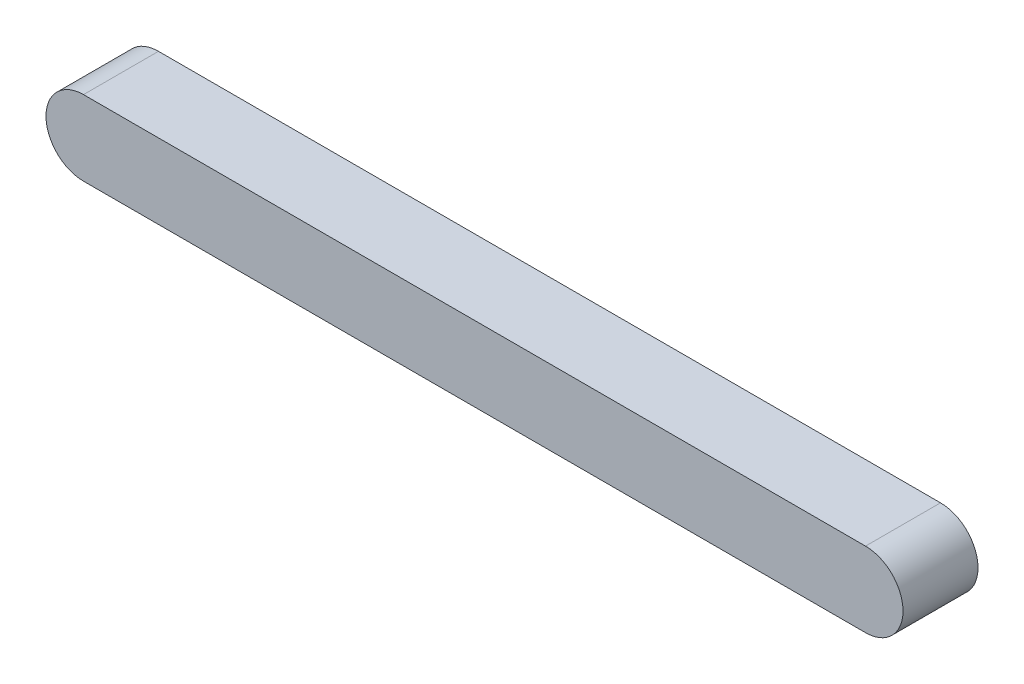
ISO-10303-21;
HEADER;
FILE_DESCRIPTION(('STEP AP214'),'2;1');
FILE_NAME('part.step','',(''),(''),'','','');
FILE_SCHEMA(('AUTOMOTIVE_DESIGN { 1 0 10303 214 1 1 1 1 }'));
ENDSEC;
DATA;
#1=APPLICATION_CONTEXT('core data for automotive mechanical design processes');
#2=APPLICATION_PROTOCOL_DEFINITION('international standard','automotive_design',2000,#1);
#3=PRODUCT_CONTEXT('',#1,'mechanical');
#4=PRODUCT('Part','Part','',(#3));
#5=PRODUCT_RELATED_PRODUCT_CATEGORY('part','',(#4));
#6=PRODUCT_DEFINITION_FORMATION('','',#4);
#7=PRODUCT_DEFINITION_CONTEXT('part definition',#1,'design');
#8=PRODUCT_DEFINITION('design','',#6,#7);
#9=PRODUCT_DEFINITION_SHAPE('','',#8);
#10=(LENGTH_UNIT() NAMED_UNIT(*) SI_UNIT(.MILLI.,.METRE.));
#11=(NAMED_UNIT(*) PLANE_ANGLE_UNIT() SI_UNIT($,.RADIAN.));
#12=(NAMED_UNIT(*) SI_UNIT($,.STERADIAN.) SOLID_ANGLE_UNIT());
#13=UNCERTAINTY_MEASURE_WITH_UNIT(LENGTH_MEASURE(1.E-05),#10,'distance_accuracy_value','');
#14=(GEOMETRIC_REPRESENTATION_CONTEXT(3) GLOBAL_UNCERTAINTY_ASSIGNED_CONTEXT((#13)) GLOBAL_UNIT_ASSIGNED_CONTEXT((#10,
#11,#12)) REPRESENTATION_CONTEXT('',''));
#15=CARTESIAN_POINT('',(0.,0.,0.));
#16=DIRECTION('',(0.,0.,1.));
#17=DIRECTION('',(1.,0.,0.));
#18=AXIS2_PLACEMENT_3D('',#15,#16,#17);
#19=CARTESIAN_POINT('',(-36.5,0.,7.));
#20=DIRECTION('',(0.,0.,-1.));
#21=DIRECTION('',(-1.,0.,0.));
#22=AXIS2_PLACEMENT_3D('',#19,#20,#21);
#23=CYLINDRICAL_SURFACE('',#22,3.49999999999999);
#24=CARTESIAN_POINT('',(-36.5,0.,0.));
#25=DIRECTION('',(0.,0.,1.));
#26=DIRECTION('',(1.,0.,0.));
#27=AXIS2_PLACEMENT_3D('',#24,#25,#26);
#28=CIRCLE('',#27,3.49999999999999);
#29=CARTESIAN_POINT('',(-36.5,3.49999999999999,0.));
#30=VERTEX_POINT('',#29);
#31=CARTESIAN_POINT('',(-36.5,-3.49999999999999,0.));
#32=VERTEX_POINT('',#31);
#33=EDGE_CURVE('E97',#30,#32,#28,.T.);
#34=ORIENTED_EDGE('',*,*,#33,.T.);
#35=DIRECTION('',(0.,0.,-1.));
#36=VECTOR('',#35,1.);
#37=CARTESIAN_POINT('',(-36.5,-3.49999999999999,7.));
#38=LINE('',#37,#36);
#39=CARTESIAN_POINT('',(-36.5,-3.49999999999999,7.));
#40=VERTEX_POINT('',#39);
#41=EDGE_CURVE('E11',#40,#32,#38,.T.);
#42=ORIENTED_EDGE('',*,*,#41,.F.);
#43=CARTESIAN_POINT('',(-36.5,0.,7.));
#44=DIRECTION('',(0.,0.,1.));
#45=DIRECTION('',(1.,0.,0.));
#46=AXIS2_PLACEMENT_3D('',#43,#44,#45);
#47=CIRCLE('',#46,3.49999999999999);
#48=CARTESIAN_POINT('',(-36.5,3.49999999999999,7.));
#49=VERTEX_POINT('',#48);
#50=EDGE_CURVE('E85',#49,#40,#47,.T.);
#51=ORIENTED_EDGE('',*,*,#50,.F.);
#52=DIRECTION('',(0.,0.,-1.));
#53=VECTOR('',#52,1.);
#54=CARTESIAN_POINT('',(-36.5,3.49999999999999,7.));
#55=LINE('',#54,#53);
#56=EDGE_CURVE('E93',#49,#30,#55,.T.);
#57=ORIENTED_EDGE('',*,*,#56,.T.);
#58=EDGE_LOOP('',(#34,#42,#51,#57));
#59=FACE_BOUND('',#58,.T.);
#60=ADVANCED_FACE('F34',(#59),#23,.T.);
#61=CARTESIAN_POINT('',(-36.5,-3.49999999999999,7.));
#62=DIRECTION('',(0.,1.,0.));
#63=DIRECTION('',(-1.,0.,0.));
#64=AXIS2_PLACEMENT_3D('',#61,#62,#63);
#65=PLANE('',#64);
#66=DIRECTION('',(1.,0.,0.));
#67=VECTOR('',#66,1.);
#68=CARTESIAN_POINT('',(-36.5,-3.49999999999999,0.));
#69=LINE('',#68,#67);
#70=CARTESIAN_POINT('',(36.5,-3.49999999999997,0.));
#71=VERTEX_POINT('',#70);
#72=EDGE_CURVE('E89',#32,#71,#69,.T.);
#73=ORIENTED_EDGE('',*,*,#72,.T.);
#74=DIRECTION('',(0.,0.,-1.));
#75=VECTOR('',#74,1.);
#76=CARTESIAN_POINT('',(36.5,-3.49999999999997,7.));
#77=LINE('',#76,#75);
#78=CARTESIAN_POINT('',(36.5,-3.49999999999997,7.));
#79=VERTEX_POINT('',#78);
#80=EDGE_CURVE('E42',#79,#71,#77,.T.);
#81=ORIENTED_EDGE('',*,*,#80,.F.);
#82=DIRECTION('',(1.,0.,0.));
#83=VECTOR('',#82,1.);
#84=CARTESIAN_POINT('',(-36.5,-3.49999999999999,7.));
#85=LINE('',#84,#83);
#86=EDGE_CURVE('E80',#40,#79,#85,.T.);
#87=ORIENTED_EDGE('',*,*,#86,.F.);
#88=ORIENTED_EDGE('',*,*,#41,.T.);
#89=EDGE_LOOP('',(#73,#81,#87,#88));
#90=FACE_BOUND('',#89,.T.);
#91=ADVANCED_FACE('F88',(#90),#65,.F.);
#92=CARTESIAN_POINT('',(36.5,0.,7.));
#93=DIRECTION('',(0.,0.,-1.));
#94=DIRECTION('',(-1.,0.,0.));
#95=AXIS2_PLACEMENT_3D('',#92,#93,#94);
#96=CYLINDRICAL_SURFACE('',#95,3.49999999999999);
#97=CARTESIAN_POINT('',(36.5,0.,0.));
#98=DIRECTION('',(0.,0.,1.));
#99=DIRECTION('',(1.,0.,0.));
#100=AXIS2_PLACEMENT_3D('',#97,#98,#99);
#101=CIRCLE('',#100,3.49999999999999);
#102=CARTESIAN_POINT('',(36.5,3.5,0.));
#103=VERTEX_POINT('',#102);
#104=EDGE_CURVE('E67',#71,#103,#101,.T.);
#105=ORIENTED_EDGE('',*,*,#104,.T.);
#106=DIRECTION('',(0.,0.,-1.));
#107=VECTOR('',#106,1.);
#108=CARTESIAN_POINT('',(36.5,3.5,7.));
#109=LINE('',#108,#107);
#110=CARTESIAN_POINT('',(36.5,3.5,7.));
#111=VERTEX_POINT('',#110);
#112=EDGE_CURVE('E90',#111,#103,#109,.T.);
#113=ORIENTED_EDGE('',*,*,#112,.F.);
#114=CARTESIAN_POINT('',(36.5,0.,7.));
#115=DIRECTION('',(0.,0.,1.));
#116=DIRECTION('',(1.,0.,0.));
#117=AXIS2_PLACEMENT_3D('',#114,#115,#116);
#118=CIRCLE('',#117,3.49999999999999);
#119=EDGE_CURVE('E83',#79,#111,#118,.T.);
#120=ORIENTED_EDGE('',*,*,#119,.F.);
#121=ORIENTED_EDGE('',*,*,#80,.T.);
#122=EDGE_LOOP('',(#105,#113,#120,#121));
#123=FACE_BOUND('',#122,.T.);
#124=ADVANCED_FACE('F91',(#123),#96,.T.);
#125=CARTESIAN_POINT('',(-36.5,3.49999999999999,7.));
#126=DIRECTION('',(0.,-1.,0.));
#127=DIRECTION('',(1.,0.,0.));
#128=AXIS2_PLACEMENT_3D('',#125,#126,#127);
#129=PLANE('',#128);
#130=DIRECTION('',(-1.,0.,0.));
#131=VECTOR('',#130,1.);
#132=CARTESIAN_POINT('',(-36.5,3.49999999999999,0.));
#133=LINE('',#132,#131);
#134=EDGE_CURVE('E73',#103,#30,#133,.T.);
#135=ORIENTED_EDGE('',*,*,#134,.T.);
#136=ORIENTED_EDGE('',*,*,#56,.F.);
#137=DIRECTION('',(-1.,0.,0.));
#138=VECTOR('',#137,1.);
#139=CARTESIAN_POINT('',(-36.5,3.49999999999999,7.));
#140=LINE('',#139,#138);
#141=EDGE_CURVE('E50',#111,#49,#140,.T.);
#142=ORIENTED_EDGE('',*,*,#141,.F.);
#143=ORIENTED_EDGE('',*,*,#112,.T.);
#144=EDGE_LOOP('',(#135,#136,#142,#143));
#145=FACE_BOUND('',#144,.T.);
#146=ADVANCED_FACE('F104',(#145),#129,.F.);
#147=CARTESIAN_POINT('',(-36.5,0.,7.));
#148=DIRECTION('',(0.,0.,1.));
#149=DIRECTION('',(1.,0.,0.));
#150=AXIS2_PLACEMENT_3D('',#147,#148,#149);
#151=PLANE('',#150);
#152=ORIENTED_EDGE('',*,*,#50,.T.);
#153=ORIENTED_EDGE('',*,*,#86,.T.);
#154=ORIENTED_EDGE('',*,*,#119,.T.);
#155=ORIENTED_EDGE('',*,*,#141,.T.);
#156=EDGE_LOOP('',(#152,#153,#154,#155));
#157=FACE_BOUND('',#156,.T.);
#158=ADVANCED_FACE('F81',(#157),#151,.T.);
#159=CARTESIAN_POINT('',(-36.5,0.,0.));
#160=DIRECTION('',(0.,0.,1.));
#161=DIRECTION('',(1.,0.,0.));
#162=AXIS2_PLACEMENT_3D('',#159,#160,#161);
#163=PLANE('',#162);
#164=ORIENTED_EDGE('',*,*,#33,.F.);
#165=ORIENTED_EDGE('',*,*,#134,.F.);
#166=ORIENTED_EDGE('',*,*,#104,.F.);
#167=ORIENTED_EDGE('',*,*,#72,.F.);
#168=EDGE_LOOP('',(#164,#165,#166,#167));
#169=FACE_BOUND('',#168,.T.);
#170=ADVANCED_FACE('F107',(#169),#163,.F.);
#171=CLOSED_SHELL('',(#60,#91,#124,#146,#158,#170));
#172=MANIFOLD_SOLID_BREP('B2',#171);
#173=ADVANCED_BREP_SHAPE_REPRESENTATION('',(#18,#172),#14);
#174=SHAPE_DEFINITION_REPRESENTATION(#9,#173);
ENDSEC;
END-ISO-10303-21;
